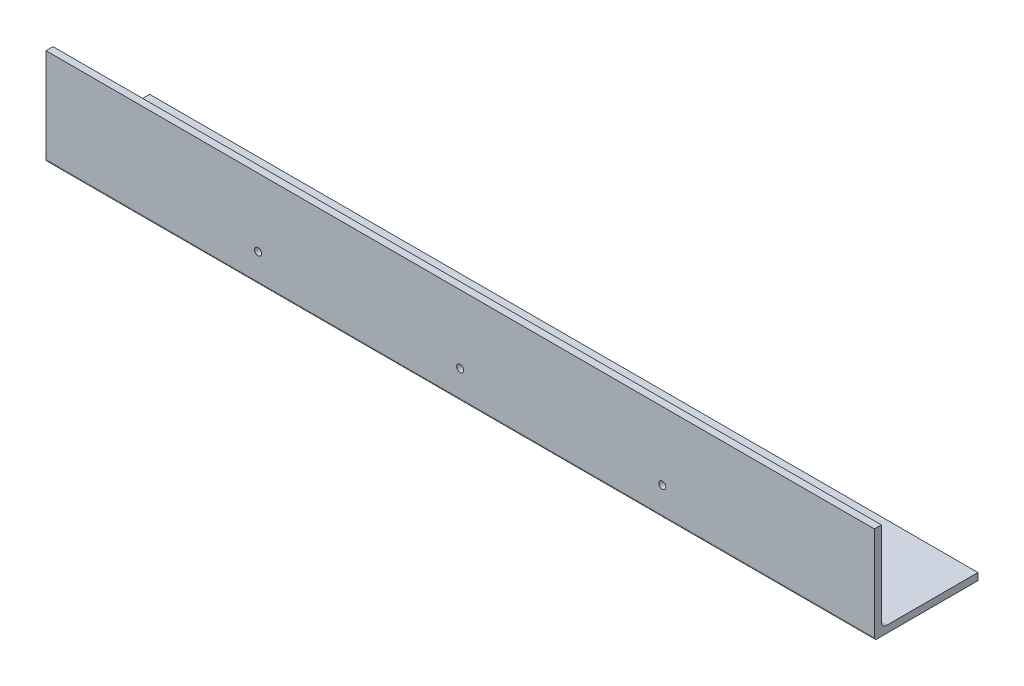
ISO-10303-21;
HEADER;
FILE_DESCRIPTION(('STEP AP214'),'2;1');
FILE_NAME('part.step','',(''),(''),'','','');
FILE_SCHEMA(('AUTOMOTIVE_DESIGN { 1 0 10303 214 1 1 1 1 }'));
ENDSEC;
DATA;
#1=APPLICATION_CONTEXT('core data for automotive mechanical design processes');
#2=APPLICATION_PROTOCOL_DEFINITION('international standard','automotive_design',2000,#1);
#3=PRODUCT_CONTEXT('',#1,'mechanical');
#4=PRODUCT('Part','Part','',(#3));
#5=PRODUCT_RELATED_PRODUCT_CATEGORY('part','',(#4));
#6=PRODUCT_DEFINITION_FORMATION('','',#4);
#7=PRODUCT_DEFINITION_CONTEXT('part definition',#1,'design');
#8=PRODUCT_DEFINITION('design','',#6,#7);
#9=PRODUCT_DEFINITION_SHAPE('','',#8);
#10=(LENGTH_UNIT() NAMED_UNIT(*) SI_UNIT(.MILLI.,.METRE.));
#11=(NAMED_UNIT(*) PLANE_ANGLE_UNIT() SI_UNIT($,.RADIAN.));
#12=(NAMED_UNIT(*) SI_UNIT($,.STERADIAN.) SOLID_ANGLE_UNIT());
#13=UNCERTAINTY_MEASURE_WITH_UNIT(LENGTH_MEASURE(1.E-05),#10,'distance_accuracy_value','');
#14=(GEOMETRIC_REPRESENTATION_CONTEXT(3) GLOBAL_UNCERTAINTY_ASSIGNED_CONTEXT((#13)) GLOBAL_UNIT_ASSIGNED_CONTEXT((#10,
#11,#12)) REPRESENTATION_CONTEXT('',''));
#15=CARTESIAN_POINT('',(0.,0.,0.));
#16=DIRECTION('',(0.,0.,1.));
#17=DIRECTION('',(1.,0.,0.));
#18=AXIS2_PLACEMENT_3D('',#15,#16,#17);
#19=CARTESIAN_POINT('',(-235.625,-27.5,0.));
#20=DIRECTION('',(0.,0.,1.));
#21=DIRECTION('',(1.,0.,0.));
#22=AXIS2_PLACEMENT_3D('',#19,#20,#21);
#23=PLANE('',#22);
#24=CARTESIAN_POINT('',(115.,-11.2375,0.));
#25=DIRECTION('',(0.,0.,1.));
#26=DIRECTION('',(1.,0.,0.));
#27=AXIS2_PLACEMENT_3D('',#24,#25,#26);
#28=CIRCLE('',#27,2.);
#29=CARTESIAN_POINT('',(117.,-11.2375,0.));
#30=VERTEX_POINT('',#29);
#31=EDGE_CURVE('E312',#30,#30,#28,.F.);
#32=ORIENTED_EDGE('',*,*,#31,.F.);
#33=EDGE_LOOP('',(#32));
#34=FACE_BOUND('',#33,.T.);
#35=CARTESIAN_POINT('',(0.,-11.2375,0.));
#36=DIRECTION('',(0.,0.,1.));
#37=DIRECTION('',(1.,0.,0.));
#38=AXIS2_PLACEMENT_3D('',#35,#36,#37);
#39=CIRCLE('',#38,2.);
#40=CARTESIAN_POINT('',(2.,-11.2375,0.));
#41=VERTEX_POINT('',#40);
#42=EDGE_CURVE('E316',#41,#41,#39,.F.);
#43=ORIENTED_EDGE('',*,*,#42,.F.);
#44=EDGE_LOOP('',(#43));
#45=FACE_BOUND('',#44,.T.);
#46=CARTESIAN_POINT('',(-115.,-11.2375,0.));
#47=DIRECTION('',(0.,0.,1.));
#48=DIRECTION('',(1.,0.,0.));
#49=AXIS2_PLACEMENT_3D('',#46,#47,#48);
#50=CIRCLE('',#49,2.);
#51=CARTESIAN_POINT('',(-113.,-11.2375,0.));
#52=VERTEX_POINT('',#51);
#53=EDGE_CURVE('E112',#52,#52,#50,.F.);
#54=ORIENTED_EDGE('',*,*,#53,.F.);
#55=EDGE_LOOP('',(#54));
#56=FACE_BOUND('',#55,.T.);
#57=DIRECTION('',(0.,1.,0.));
#58=VECTOR('',#57,1.);
#59=CARTESIAN_POINT('',(235.625,27.5,0.));
#60=LINE('',#59,#58);
#61=CARTESIAN_POINT('',(235.625,-20.5,0.));
#62=VERTEX_POINT('',#61);
#63=CARTESIAN_POINT('',(235.625,27.5,0.));
#64=VERTEX_POINT('',#63);
#65=EDGE_CURVE('E140',#62,#64,#60,.T.);
#66=ORIENTED_EDGE('',*,*,#65,.F.);
#67=DIRECTION('',(1.,0.,0.));
#68=VECTOR('',#67,1.);
#69=CARTESIAN_POINT('',(-235.625,-20.5,0.));
#70=LINE('',#69,#68);
#71=CARTESIAN_POINT('',(-235.625,-20.5,0.));
#72=VERTEX_POINT('',#71);
#73=EDGE_CURVE('E152',#62,#72,#70,.F.);
#74=ORIENTED_EDGE('',*,*,#73,.T.);
#75=DIRECTION('',(0.,-1.,0.));
#76=VECTOR('',#75,1.);
#77=CARTESIAN_POINT('',(-235.625,27.5,0.));
#78=LINE('',#77,#76);
#79=CARTESIAN_POINT('',(-235.625,27.5,0.));
#80=VERTEX_POINT('',#79);
#81=EDGE_CURVE('E136',#80,#72,#78,.T.);
#82=ORIENTED_EDGE('',*,*,#81,.F.);
#83=DIRECTION('',(-1.,0.,0.));
#84=VECTOR('',#83,1.);
#85=CARTESIAN_POINT('',(-235.625,27.5,0.));
#86=LINE('',#85,#84);
#87=EDGE_CURVE('E126',#64,#80,#86,.T.);
#88=ORIENTED_EDGE('',*,*,#87,.F.);
#89=EDGE_LOOP('',(#66,#74,#82,#88));
#90=FACE_BOUND('',#89,.T.);
#91=ADVANCED_FACE('F31',(#34,#45,#56,#90),#23,.F.);
#92=CARTESIAN_POINT('',(-235.625,27.5,4.));
#93=DIRECTION('',(1.,0.,0.));
#94=DIRECTION('',(0.,0.,-1.));
#95=AXIS2_PLACEMENT_3D('',#92,#93,#94);
#96=PLANE('',#95);
#97=DIRECTION('',(0.,0.,-1.));
#98=VECTOR('',#97,1.);
#99=CARTESIAN_POINT('',(-235.625,-27.5,4.));
#100=LINE('',#99,#98);
#101=CARTESIAN_POINT('',(-235.625,-27.5,2.5));
#102=VERTEX_POINT('',#101);
#103=CARTESIAN_POINT('',(-235.625,-27.5,-55.));
#104=VERTEX_POINT('',#103);
#105=EDGE_CURVE('E98',#102,#104,#100,.T.);
#106=ORIENTED_EDGE('',*,*,#105,.F.);
#107=CARTESIAN_POINT('',(-235.625,-26.,2.5));
#108=DIRECTION('',(1.,0.,0.));
#109=DIRECTION('',(0.,0.,-1.));
#110=AXIS2_PLACEMENT_3D('',#107,#108,#109);
#111=CIRCLE('',#110,1.5);
#112=CARTESIAN_POINT('',(-235.625,-26.,4.));
#113=VERTEX_POINT('',#112);
#114=EDGE_CURVE('E11',#102,#113,#111,.F.);
#115=ORIENTED_EDGE('',*,*,#114,.T.);
#116=DIRECTION('',(0.,-1.,0.));
#117=VECTOR('',#116,1.);
#118=CARTESIAN_POINT('',(-235.625,27.5,4.));
#119=LINE('',#118,#117);
#120=CARTESIAN_POINT('',(-235.625,27.5,4.));
#121=VERTEX_POINT('',#120);
#122=EDGE_CURVE('E122',#121,#113,#119,.T.);
#123=ORIENTED_EDGE('',*,*,#122,.F.);
#124=DIRECTION('',(0.,0.,-1.));
#125=VECTOR('',#124,1.);
#126=CARTESIAN_POINT('',(-235.625,27.5,4.));
#127=LINE('',#126,#125);
#128=EDGE_CURVE('E130',#121,#80,#127,.T.);
#129=ORIENTED_EDGE('',*,*,#128,.T.);
#130=ORIENTED_EDGE('',*,*,#81,.T.);
#131=CARTESIAN_POINT('',(-235.625,-20.5,-3.));
#132=DIRECTION('',(1.,0.,0.));
#133=DIRECTION('',(0.,0.,-1.));
#134=AXIS2_PLACEMENT_3D('',#131,#132,#133);
#135=CIRCLE('',#134,3.);
#136=CARTESIAN_POINT('',(-235.625,-23.5,-3.));
#137=VERTEX_POINT('',#136);
#138=EDGE_CURVE('E157',#72,#137,#135,.T.);
#139=ORIENTED_EDGE('',*,*,#138,.T.);
#140=DIRECTION('',(0.,0.,1.));
#141=VECTOR('',#140,1.);
#142=CARTESIAN_POINT('',(-235.625,-23.5,-55.));
#143=LINE('',#142,#141);
#144=CARTESIAN_POINT('',(-235.625,-23.5,-55.));
#145=VERTEX_POINT('',#144);
#146=EDGE_CURVE('E141',#145,#137,#143,.T.);
#147=ORIENTED_EDGE('',*,*,#146,.F.);
#148=DIRECTION('',(0.,1.,0.));
#149=VECTOR('',#148,1.);
#150=CARTESIAN_POINT('',(-235.625,-23.5,-55.));
#151=LINE('',#150,#149);
#152=EDGE_CURVE('E106',#104,#145,#151,.T.);
#153=ORIENTED_EDGE('',*,*,#152,.F.);
#154=EDGE_LOOP('',(#106,#115,#123,#129,#130,#139,#147,#153));
#155=FACE_BOUND('',#154,.T.);
#156=ADVANCED_FACE('F181',(#155),#96,.F.);
#157=CARTESIAN_POINT('',(-235.625,-27.5,4.));
#158=DIRECTION('',(0.,1.,0.));
#159=DIRECTION('',(0.,0.,1.));
#160=AXIS2_PLACEMENT_3D('',#157,#158,#159);
#161=PLANE('',#160);
#162=DIRECTION('',(0.,0.,-1.));
#163=VECTOR('',#162,1.);
#164=CARTESIAN_POINT('',(235.625,-27.5,4.));
#165=LINE('',#164,#163);
#166=CARTESIAN_POINT('',(235.625,-27.5,2.5));
#167=VERTEX_POINT('',#166);
#168=CARTESIAN_POINT('',(235.625,-27.5,-55.));
#169=VERTEX_POINT('',#168);
#170=EDGE_CURVE('E92',#167,#169,#165,.T.);
#171=ORIENTED_EDGE('',*,*,#170,.F.);
#172=DIRECTION('',(1.,0.,0.));
#173=VECTOR('',#172,1.);
#174=CARTESIAN_POINT('',(-235.625,-27.5,2.5));
#175=LINE('',#174,#173);
#176=EDGE_CURVE('E39',#167,#102,#175,.F.);
#177=ORIENTED_EDGE('',*,*,#176,.T.);
#178=ORIENTED_EDGE('',*,*,#105,.T.);
#179=DIRECTION('',(-1.,0.,0.));
#180=VECTOR('',#179,1.);
#181=CARTESIAN_POINT('',(235.625,-27.5,-55.));
#182=LINE('',#181,#180);
#183=EDGE_CURVE('E102',#169,#104,#182,.T.);
#184=ORIENTED_EDGE('',*,*,#183,.F.);
#185=EDGE_LOOP('',(#171,#177,#178,#184));
#186=FACE_BOUND('',#185,.T.);
#187=ADVANCED_FACE('F103',(#186),#161,.F.);
#188=CARTESIAN_POINT('',(235.625,27.5,4.));
#189=DIRECTION('',(-1.,0.,0.));
#190=DIRECTION('',(0.,0.,1.));
#191=AXIS2_PLACEMENT_3D('',#188,#189,#190);
#192=PLANE('',#191);
#193=DIRECTION('',(0.,1.,0.));
#194=VECTOR('',#193,1.);
#195=CARTESIAN_POINT('',(235.625,27.5,4.));
#196=LINE('',#195,#194);
#197=CARTESIAN_POINT('',(235.625,-26.,4.));
#198=VERTEX_POINT('',#197);
#199=CARTESIAN_POINT('',(235.625,27.5,4.));
#200=VERTEX_POINT('',#199);
#201=EDGE_CURVE('E125',#198,#200,#196,.T.);
#202=ORIENTED_EDGE('',*,*,#201,.F.);
#203=CARTESIAN_POINT('',(235.625,-26.,2.5));
#204=DIRECTION('',(-1.,0.,0.));
#205=DIRECTION('',(0.,0.,1.));
#206=AXIS2_PLACEMENT_3D('',#203,#204,#205);
#207=CIRCLE('',#206,1.5);
#208=EDGE_CURVE('E53',#198,#167,#207,.F.);
#209=ORIENTED_EDGE('',*,*,#208,.T.);
#210=ORIENTED_EDGE('',*,*,#170,.T.);
#211=DIRECTION('',(0.,-1.,0.));
#212=VECTOR('',#211,1.);
#213=CARTESIAN_POINT('',(235.625,-23.5,-55.));
#214=LINE('',#213,#212);
#215=CARTESIAN_POINT('',(235.625,-23.5,-55.));
#216=VERTEX_POINT('',#215);
#217=EDGE_CURVE('E97',#216,#169,#214,.T.);
#218=ORIENTED_EDGE('',*,*,#217,.F.);
#219=DIRECTION('',(0.,0.,1.));
#220=VECTOR('',#219,1.);
#221=CARTESIAN_POINT('',(235.625,-23.5,-55.));
#222=LINE('',#221,#220);
#223=CARTESIAN_POINT('',(235.625,-23.5,-3.));
#224=VERTEX_POINT('',#223);
#225=EDGE_CURVE('E121',#216,#224,#222,.T.);
#226=ORIENTED_EDGE('',*,*,#225,.T.);
#227=CARTESIAN_POINT('',(235.625,-20.5,-3.));
#228=DIRECTION('',(-1.,0.,0.));
#229=DIRECTION('',(0.,0.,1.));
#230=AXIS2_PLACEMENT_3D('',#227,#228,#229);
#231=CIRCLE('',#230,3.);
#232=EDGE_CURVE('E155',#224,#62,#231,.T.);
#233=ORIENTED_EDGE('',*,*,#232,.T.);
#234=ORIENTED_EDGE('',*,*,#65,.T.);
#235=DIRECTION('',(0.,0.,-1.));
#236=VECTOR('',#235,1.);
#237=CARTESIAN_POINT('',(235.625,27.5,4.));
#238=LINE('',#237,#236);
#239=EDGE_CURVE('E99',#200,#64,#238,.T.);
#240=ORIENTED_EDGE('',*,*,#239,.F.);
#241=EDGE_LOOP('',(#202,#209,#210,#218,#226,#233,#234,#240));
#242=FACE_BOUND('',#241,.T.);
#243=ADVANCED_FACE('F94',(#242),#192,.F.);
#244=CARTESIAN_POINT('',(-235.625,27.5,4.));
#245=DIRECTION('',(0.,-1.,0.));
#246=DIRECTION('',(0.,0.,-1.));
#247=AXIS2_PLACEMENT_3D('',#244,#245,#246);
#248=PLANE('',#247);
#249=ORIENTED_EDGE('',*,*,#87,.T.);
#250=ORIENTED_EDGE('',*,*,#128,.F.);
#251=DIRECTION('',(-1.,0.,0.));
#252=VECTOR('',#251,1.);
#253=CARTESIAN_POINT('',(-235.625,27.5,4.));
#254=LINE('',#253,#252);
#255=EDGE_CURVE('E128',#200,#121,#254,.T.);
#256=ORIENTED_EDGE('',*,*,#255,.F.);
#257=ORIENTED_EDGE('',*,*,#239,.T.);
#258=EDGE_LOOP('',(#249,#250,#256,#257));
#259=FACE_BOUND('',#258,.T.);
#260=ADVANCED_FACE('F176',(#259),#248,.F.);
#261=CARTESIAN_POINT('',(-235.625,-27.5,4.));
#262=DIRECTION('',(0.,0.,1.));
#263=DIRECTION('',(1.,0.,0.));
#264=AXIS2_PLACEMENT_3D('',#261,#262,#263);
#265=PLANE('',#264);
#266=CARTESIAN_POINT('',(115.,-11.2375,4.));
#267=DIRECTION('',(0.,0.,1.));
#268=DIRECTION('',(1.,0.,0.));
#269=AXIS2_PLACEMENT_3D('',#266,#267,#268);
#270=CIRCLE('',#269,2.);
#271=CARTESIAN_POINT('',(117.,-11.2375,4.));
#272=VERTEX_POINT('',#271);
#273=EDGE_CURVE('E310',#272,#272,#270,.T.);
#274=ORIENTED_EDGE('',*,*,#273,.F.);
#275=EDGE_LOOP('',(#274));
#276=FACE_BOUND('',#275,.T.);
#277=CARTESIAN_POINT('',(0.,-11.2375,4.));
#278=DIRECTION('',(0.,0.,1.));
#279=DIRECTION('',(1.,0.,0.));
#280=AXIS2_PLACEMENT_3D('',#277,#278,#279);
#281=CIRCLE('',#280,2.);
#282=CARTESIAN_POINT('',(2.,-11.2375,4.));
#283=VERTEX_POINT('',#282);
#284=EDGE_CURVE('E313',#283,#283,#281,.T.);
#285=ORIENTED_EDGE('',*,*,#284,.F.);
#286=EDGE_LOOP('',(#285));
#287=FACE_BOUND('',#286,.T.);
#288=CARTESIAN_POINT('',(-115.,-11.2375,4.));
#289=DIRECTION('',(0.,0.,1.));
#290=DIRECTION('',(1.,0.,0.));
#291=AXIS2_PLACEMENT_3D('',#288,#289,#290);
#292=CIRCLE('',#291,2.);
#293=CARTESIAN_POINT('',(-113.,-11.2375,4.));
#294=VERTEX_POINT('',#293);
#295=EDGE_CURVE('E115',#294,#294,#292,.T.);
#296=ORIENTED_EDGE('',*,*,#295,.F.);
#297=EDGE_LOOP('',(#296));
#298=FACE_BOUND('',#297,.T.);
#299=ORIENTED_EDGE('',*,*,#122,.T.);
#300=DIRECTION('',(1.,0.,0.));
#301=VECTOR('',#300,1.);
#302=CARTESIAN_POINT('',(235.625,-26.,4.));
#303=LINE('',#302,#301);
#304=EDGE_CURVE('E159',#113,#198,#303,.T.);
#305=ORIENTED_EDGE('',*,*,#304,.T.);
#306=ORIENTED_EDGE('',*,*,#201,.T.);
#307=ORIENTED_EDGE('',*,*,#255,.T.);
#308=EDGE_LOOP('',(#299,#305,#306,#307));
#309=FACE_BOUND('',#308,.T.);
#310=ADVANCED_FACE('F164',(#276,#287,#298,#309),#265,.T.);
#311=CARTESIAN_POINT('',(235.625,-23.5,-55.));
#312=DIRECTION('',(0.,-1.,0.));
#313=DIRECTION('',(0.,0.,-1.));
#314=AXIS2_PLACEMENT_3D('',#311,#312,#313);
#315=PLANE('',#314);
#316=ORIENTED_EDGE('',*,*,#146,.T.);
#317=DIRECTION('',(1.,0.,0.));
#318=VECTOR('',#317,1.);
#319=CARTESIAN_POINT('',(235.625,-23.5,-3.));
#320=LINE('',#319,#318);
#321=EDGE_CURVE('E149',#137,#224,#320,.T.);
#322=ORIENTED_EDGE('',*,*,#321,.T.);
#323=ORIENTED_EDGE('',*,*,#225,.F.);
#324=DIRECTION('',(1.,0.,0.));
#325=VECTOR('',#324,1.);
#326=CARTESIAN_POINT('',(235.625,-23.5,-55.));
#327=LINE('',#326,#325);
#328=EDGE_CURVE('E110',#145,#216,#327,.T.);
#329=ORIENTED_EDGE('',*,*,#328,.F.);
#330=EDGE_LOOP('',(#316,#322,#323,#329));
#331=FACE_BOUND('',#330,.T.);
#332=ADVANCED_FACE('F230',(#331),#315,.F.);
#333=CARTESIAN_POINT('',(235.625,-27.5,-55.));
#334=DIRECTION('',(0.,0.,-1.));
#335=DIRECTION('',(-1.,0.,0.));
#336=AXIS2_PLACEMENT_3D('',#333,#334,#335);
#337=PLANE('',#336);
#338=ORIENTED_EDGE('',*,*,#217,.T.);
#339=ORIENTED_EDGE('',*,*,#183,.T.);
#340=ORIENTED_EDGE('',*,*,#152,.T.);
#341=ORIENTED_EDGE('',*,*,#328,.T.);
#342=EDGE_LOOP('',(#338,#339,#340,#341));
#343=FACE_BOUND('',#342,.T.);
#344=ADVANCED_FACE('F108',(#343),#337,.T.);
#345=CARTESIAN_POINT('',(235.625,-20.5,-3.));
#346=DIRECTION('',(-1.,0.,0.));
#347=DIRECTION('',(0.,0.,1.));
#348=AXIS2_PLACEMENT_3D('',#345,#346,#347);
#349=CYLINDRICAL_SURFACE('',#348,3.);
#350=ORIENTED_EDGE('',*,*,#138,.F.);
#351=ORIENTED_EDGE('',*,*,#73,.F.);
#352=ORIENTED_EDGE('',*,*,#232,.F.);
#353=ORIENTED_EDGE('',*,*,#321,.F.);
#354=EDGE_LOOP('',(#350,#351,#352,#353));
#355=FACE_BOUND('',#354,.T.);
#356=ADVANCED_FACE('F184',(#355),#349,.F.);
#357=CARTESIAN_POINT('',(-235.625,-26.,2.5));
#358=DIRECTION('',(-1.,0.,0.));
#359=DIRECTION('',(0.,0.,1.));
#360=AXIS2_PLACEMENT_3D('',#357,#358,#359);
#361=CYLINDRICAL_SURFACE('',#360,1.5);
#362=ORIENTED_EDGE('',*,*,#114,.F.);
#363=ORIENTED_EDGE('',*,*,#176,.F.);
#364=ORIENTED_EDGE('',*,*,#208,.F.);
#365=ORIENTED_EDGE('',*,*,#304,.F.);
#366=EDGE_LOOP('',(#362,#363,#364,#365));
#367=FACE_BOUND('',#366,.T.);
#368=ADVANCED_FACE('F33',(#367),#361,.T.);
#369=CARTESIAN_POINT('',(-115.,-11.2375,-55.001));
#370=DIRECTION('',(0.,0.,1.));
#371=DIRECTION('',(1.,0.,0.));
#372=AXIS2_PLACEMENT_3D('',#369,#370,#371);
#373=CYLINDRICAL_SURFACE('',#372,2.);
#374=ORIENTED_EDGE('',*,*,#295,.T.);
#375=EDGE_LOOP('',(#374));
#376=FACE_BOUND('',#375,.T.);
#377=ORIENTED_EDGE('',*,*,#53,.T.);
#378=EDGE_LOOP('',(#377));
#379=FACE_BOUND('',#378,.T.);
#380=ADVANCED_FACE('F183',(#376,#379),#373,.F.);
#381=CARTESIAN_POINT('',(0.,-11.2375,-55.001));
#382=DIRECTION('',(0.,0.,1.));
#383=DIRECTION('',(1.,0.,0.));
#384=AXIS2_PLACEMENT_3D('',#381,#382,#383);
#385=CYLINDRICAL_SURFACE('',#384,2.);
#386=ORIENTED_EDGE('',*,*,#284,.T.);
#387=EDGE_LOOP('',(#386));
#388=FACE_BOUND('',#387,.T.);
#389=ORIENTED_EDGE('',*,*,#42,.T.);
#390=EDGE_LOOP('',(#389));
#391=FACE_BOUND('',#390,.T.);
#392=ADVANCED_FACE('F189',(#388,#391),#385,.F.);
#393=CARTESIAN_POINT('',(115.,-11.2375,-55.001));
#394=DIRECTION('',(0.,0.,1.));
#395=DIRECTION('',(1.,0.,0.));
#396=AXIS2_PLACEMENT_3D('',#393,#394,#395);
#397=CYLINDRICAL_SURFACE('',#396,2.);
#398=ORIENTED_EDGE('',*,*,#273,.T.);
#399=EDGE_LOOP('',(#398));
#400=FACE_BOUND('',#399,.T.);
#401=ORIENTED_EDGE('',*,*,#31,.T.);
#402=EDGE_LOOP('',(#401));
#403=FACE_BOUND('',#402,.T.);
#404=ADVANCED_FACE('F293',(#400,#403),#397,.F.);
#405=CLOSED_SHELL('',(#91,#156,#187,#243,#260,#310,#332,#344,#356,#368,#380,#392,#404));
#406=MANIFOLD_SOLID_BREP('B2',#405);
#407=ADVANCED_BREP_SHAPE_REPRESENTATION('',(#18,#406),#14);
#408=SHAPE_DEFINITION_REPRESENTATION(#9,#407);
ENDSEC;
END-ISO-10303-21;
